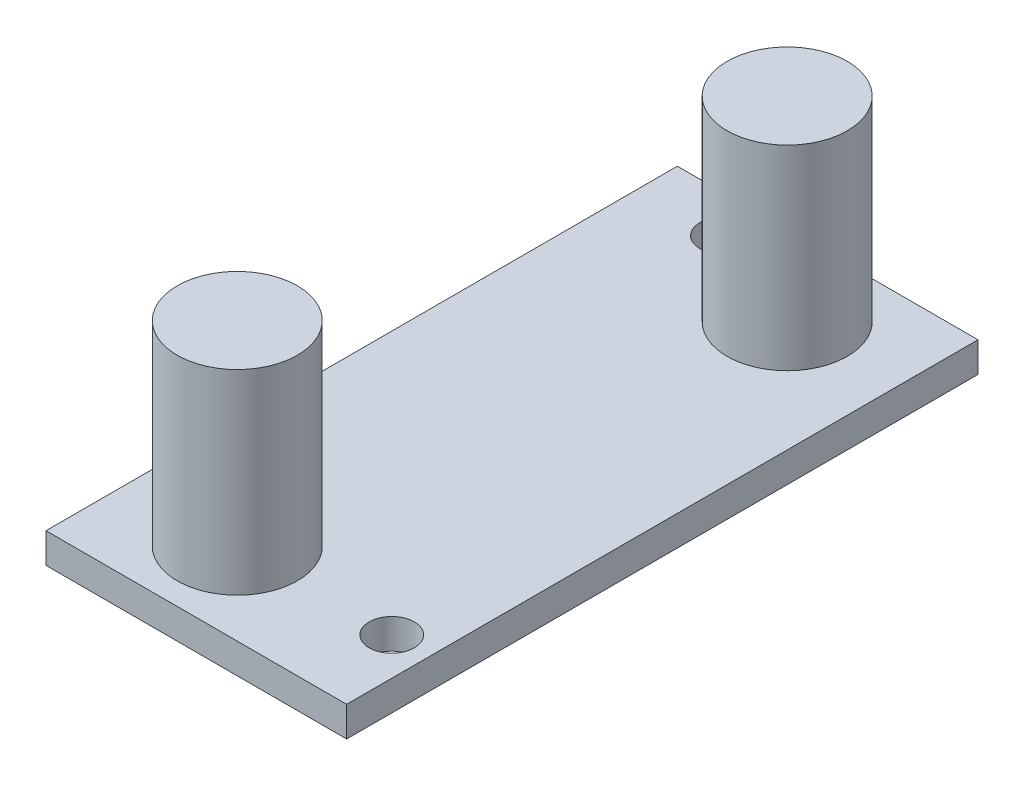
ISO-10303-21;
HEADER;
FILE_DESCRIPTION(('STEP AP214'),'2;1');
FILE_NAME('part.step','',(''),(''),'','','');
FILE_SCHEMA(('AUTOMOTIVE_DESIGN { 1 0 10303 214 1 1 1 1 }'));
ENDSEC;
DATA;
#1=APPLICATION_CONTEXT('core data for automotive mechanical design processes');
#2=APPLICATION_PROTOCOL_DEFINITION('international standard','automotive_design',2000,#1);
#3=PRODUCT_CONTEXT('',#1,'mechanical');
#4=PRODUCT('Part','Part','',(#3));
#5=PRODUCT_RELATED_PRODUCT_CATEGORY('part','',(#4));
#6=PRODUCT_DEFINITION_FORMATION('','',#4);
#7=PRODUCT_DEFINITION_CONTEXT('part definition',#1,'design');
#8=PRODUCT_DEFINITION('design','',#6,#7);
#9=PRODUCT_DEFINITION_SHAPE('','',#8);
#10=(LENGTH_UNIT() NAMED_UNIT(*) SI_UNIT(.MILLI.,.METRE.));
#11=(NAMED_UNIT(*) PLANE_ANGLE_UNIT() SI_UNIT($,.RADIAN.));
#12=(NAMED_UNIT(*) SI_UNIT($,.STERADIAN.) SOLID_ANGLE_UNIT());
#13=UNCERTAINTY_MEASURE_WITH_UNIT(LENGTH_MEASURE(1.E-05),#10,'distance_accuracy_value','');
#14=(GEOMETRIC_REPRESENTATION_CONTEXT(3) GLOBAL_UNCERTAINTY_ASSIGNED_CONTEXT((#13)) GLOBAL_UNIT_ASSIGNED_CONTEXT((#10,
#11,#12)) REPRESENTATION_CONTEXT('',''));
#15=CARTESIAN_POINT('',(0.,0.,0.));
#16=DIRECTION('',(0.,0.,1.));
#17=DIRECTION('',(1.,0.,0.));
#18=AXIS2_PLACEMENT_3D('',#15,#16,#17);
#19=CARTESIAN_POINT('',(10.,2.,21.));
#20=DIRECTION('',(-1.,0.,0.));
#21=DIRECTION('',(0.,0.,1.));
#22=AXIS2_PLACEMENT_3D('',#19,#20,#21);
#23=PLANE('',#22);
#24=DIRECTION('',(0.,0.,-1.));
#25=VECTOR('',#24,1.);
#26=CARTESIAN_POINT('',(10.,0.,21.));
#27=LINE('',#26,#25);
#28=CARTESIAN_POINT('',(10.,0.,21.));
#29=VERTEX_POINT('',#28);
#30=CARTESIAN_POINT('',(10.,0.,-21.));
#31=VERTEX_POINT('',#30);
#32=EDGE_CURVE('E112',#29,#31,#27,.T.);
#33=ORIENTED_EDGE('',*,*,#32,.T.);
#34=DIRECTION('',(0.,-1.,0.));
#35=VECTOR('',#34,1.);
#36=CARTESIAN_POINT('',(10.,2.,-21.));
#37=LINE('',#36,#35);
#38=CARTESIAN_POINT('',(10.,2.,-21.));
#39=VERTEX_POINT('',#38);
#40=EDGE_CURVE('E103',#39,#31,#37,.T.);
#41=ORIENTED_EDGE('',*,*,#40,.F.);
#42=DIRECTION('',(0.,0.,-1.));
#43=VECTOR('',#42,1.);
#44=CARTESIAN_POINT('',(10.,2.,21.));
#45=LINE('',#44,#43);
#46=CARTESIAN_POINT('',(10.,2.,21.));
#47=VERTEX_POINT('',#46);
#48=EDGE_CURVE('E97',#47,#39,#45,.T.);
#49=ORIENTED_EDGE('',*,*,#48,.F.);
#50=DIRECTION('',(0.,-1.,0.));
#51=VECTOR('',#50,1.);
#52=CARTESIAN_POINT('',(10.,2.,21.));
#53=LINE('',#52,#51);
#54=EDGE_CURVE('E108',#47,#29,#53,.T.);
#55=ORIENTED_EDGE('',*,*,#54,.T.);
#56=EDGE_LOOP('',(#33,#41,#49,#55));
#57=FACE_BOUND('',#56,.T.);
#58=ADVANCED_FACE('F45',(#57),#23,.F.);
#59=CARTESIAN_POINT('',(-10.,2.,-21.));
#60=DIRECTION('',(0.,0.,1.));
#61=DIRECTION('',(1.,0.,0.));
#62=AXIS2_PLACEMENT_3D('',#59,#60,#61);
#63=PLANE('',#62);
#64=DIRECTION('',(-1.,0.,0.));
#65=VECTOR('',#64,1.);
#66=CARTESIAN_POINT('',(-10.,0.,-21.));
#67=LINE('',#66,#65);
#68=CARTESIAN_POINT('',(-10.,0.,-21.));
#69=VERTEX_POINT('',#68);
#70=EDGE_CURVE('E102',#31,#69,#67,.T.);
#71=ORIENTED_EDGE('',*,*,#70,.T.);
#72=DIRECTION('',(0.,-1.,0.));
#73=VECTOR('',#72,1.);
#74=CARTESIAN_POINT('',(-10.,2.,-21.));
#75=LINE('',#74,#73);
#76=CARTESIAN_POINT('',(-10.,2.,-21.));
#77=VERTEX_POINT('',#76);
#78=EDGE_CURVE('E100',#77,#69,#75,.T.);
#79=ORIENTED_EDGE('',*,*,#78,.F.);
#80=DIRECTION('',(-1.,0.,0.));
#81=VECTOR('',#80,1.);
#82=CARTESIAN_POINT('',(-10.,2.,-21.));
#83=LINE('',#82,#81);
#84=EDGE_CURVE('E92',#39,#77,#83,.T.);
#85=ORIENTED_EDGE('',*,*,#84,.F.);
#86=ORIENTED_EDGE('',*,*,#40,.T.);
#87=EDGE_LOOP('',(#71,#79,#85,#86));
#88=FACE_BOUND('',#87,.T.);
#89=ADVANCED_FACE('F101',(#88),#63,.F.);
#90=CARTESIAN_POINT('',(-10.,2.,21.));
#91=DIRECTION('',(1.,0.,0.));
#92=DIRECTION('',(0.,0.,-1.));
#93=AXIS2_PLACEMENT_3D('',#90,#91,#92);
#94=PLANE('',#93);
#95=DIRECTION('',(0.,0.,1.));
#96=VECTOR('',#95,1.);
#97=CARTESIAN_POINT('',(-10.,0.,21.));
#98=LINE('',#97,#96);
#99=CARTESIAN_POINT('',(-10.,0.,21.));
#100=VERTEX_POINT('',#99);
#101=EDGE_CURVE('E78',#69,#100,#98,.T.);
#102=ORIENTED_EDGE('',*,*,#101,.T.);
#103=DIRECTION('',(0.,-1.,0.));
#104=VECTOR('',#103,1.);
#105=CARTESIAN_POINT('',(-10.,2.,21.));
#106=LINE('',#105,#104);
#107=CARTESIAN_POINT('',(-10.,2.,21.));
#108=VERTEX_POINT('',#107);
#109=EDGE_CURVE('E104',#108,#100,#106,.T.);
#110=ORIENTED_EDGE('',*,*,#109,.F.);
#111=DIRECTION('',(0.,0.,1.));
#112=VECTOR('',#111,1.);
#113=CARTESIAN_POINT('',(-10.,2.,21.));
#114=LINE('',#113,#112);
#115=EDGE_CURVE('E95',#77,#108,#114,.T.);
#116=ORIENTED_EDGE('',*,*,#115,.F.);
#117=ORIENTED_EDGE('',*,*,#78,.T.);
#118=EDGE_LOOP('',(#102,#110,#116,#117));
#119=FACE_BOUND('',#118,.T.);
#120=ADVANCED_FACE('F106',(#119),#94,.F.);
#121=CARTESIAN_POINT('',(-10.,2.,21.));
#122=DIRECTION('',(0.,0.,-1.));
#123=DIRECTION('',(-1.,0.,0.));
#124=AXIS2_PLACEMENT_3D('',#121,#122,#123);
#125=PLANE('',#124);
#126=DIRECTION('',(1.,0.,0.));
#127=VECTOR('',#126,1.);
#128=CARTESIAN_POINT('',(-10.,0.,21.));
#129=LINE('',#128,#127);
#130=EDGE_CURVE('E84',#100,#29,#129,.T.);
#131=ORIENTED_EDGE('',*,*,#130,.T.);
#132=ORIENTED_EDGE('',*,*,#54,.F.);
#133=DIRECTION('',(1.,0.,0.));
#134=VECTOR('',#133,1.);
#135=CARTESIAN_POINT('',(-10.,2.,21.));
#136=LINE('',#135,#134);
#137=EDGE_CURVE('E61',#108,#47,#136,.T.);
#138=ORIENTED_EDGE('',*,*,#137,.F.);
#139=ORIENTED_EDGE('',*,*,#109,.T.);
#140=EDGE_LOOP('',(#131,#132,#138,#139));
#141=FACE_BOUND('',#140,.T.);
#142=ADVANCED_FACE('F128',(#141),#125,.F.);
#143=CARTESIAN_POINT('',(0.,2.,0.));
#144=DIRECTION('',(0.,-1.,0.));
#145=DIRECTION('',(0.,0.,-1.));
#146=AXIS2_PLACEMENT_3D('',#143,#144,#145);
#147=PLANE('',#146);
#148=CARTESIAN_POINT('',(7.5,2.,15.5));
#149=DIRECTION('',(0.,1.,0.));
#150=DIRECTION('',(0.,0.,1.));
#151=AXIS2_PLACEMENT_3D('',#148,#149,#150);
#152=CIRCLE('',#151,1.5);
#153=CARTESIAN_POINT('',(7.5,2.,17.));
#154=VERTEX_POINT('',#153);
#155=EDGE_CURVE('E161',#154,#154,#152,.T.);
#156=ORIENTED_EDGE('',*,*,#155,.F.);
#157=EDGE_LOOP('',(#156));
#158=FACE_BOUND('',#157,.T.);
#159=CARTESIAN_POINT('',(-4.5,2.,-18.5));
#160=DIRECTION('',(0.,1.,0.));
#161=DIRECTION('',(0.,0.,1.));
#162=AXIS2_PLACEMENT_3D('',#159,#160,#161);
#163=CIRCLE('',#162,1.5);
#164=CARTESIAN_POINT('',(-4.5,2.,-17.));
#165=VERTEX_POINT('',#164);
#166=EDGE_CURVE('E155',#165,#165,#163,.T.);
#167=ORIENTED_EDGE('',*,*,#166,.F.);
#168=EDGE_LOOP('',(#167));
#169=FACE_BOUND('',#168,.T.);
#170=CARTESIAN_POINT('',(-2.74840159972659,2.,15.5259410453431));
#171=DIRECTION('',(0.,-1.,0.));
#172=DIRECTION('',(0.,0.,-1.));
#173=AXIS2_PLACEMENT_3D('',#170,#171,#172);
#174=CIRCLE('',#173,4.);
#175=CARTESIAN_POINT('',(-2.74840159972659,2.,11.5259410453431));
#176=VERTEX_POINT('',#175);
#177=EDGE_CURVE('E13',#176,#176,#174,.F.);
#178=ORIENTED_EDGE('',*,*,#177,.F.);
#179=EDGE_LOOP('',(#178));
#180=FACE_BOUND('',#179,.T.);
#181=CARTESIAN_POINT('',(2.61123832277543,2.,-15.6960883444702));
#182=DIRECTION('',(0.,-1.,0.));
#183=DIRECTION('',(0.,0.,-1.));
#184=AXIS2_PLACEMENT_3D('',#181,#182,#183);
#185=CIRCLE('',#184,4.);
#186=CARTESIAN_POINT('',(2.61123832277543,2.,-19.6960883444702));
#187=VERTEX_POINT('',#186);
#188=EDGE_CURVE('E53',#187,#187,#185,.F.);
#189=ORIENTED_EDGE('',*,*,#188,.F.);
#190=EDGE_LOOP('',(#189));
#191=FACE_BOUND('',#190,.T.);
#192=ORIENTED_EDGE('',*,*,#48,.T.);
#193=ORIENTED_EDGE('',*,*,#84,.T.);
#194=ORIENTED_EDGE('',*,*,#115,.T.);
#195=ORIENTED_EDGE('',*,*,#137,.T.);
#196=EDGE_LOOP('',(#192,#193,#194,#195));
#197=FACE_BOUND('',#196,.T.);
#198=ADVANCED_FACE('F93',(#158,#169,#180,#191,#197),#147,.F.);
#199=CARTESIAN_POINT('',(0.,0.,0.));
#200=DIRECTION('',(0.,-1.,0.));
#201=DIRECTION('',(0.,0.,-1.));
#202=AXIS2_PLACEMENT_3D('',#199,#200,#201);
#203=PLANE('',#202);
#204=CARTESIAN_POINT('',(7.5,0.,15.5));
#205=DIRECTION('',(0.,1.,0.));
#206=DIRECTION('',(0.,0.,1.));
#207=AXIS2_PLACEMENT_3D('',#204,#205,#206);
#208=CIRCLE('',#207,1.5);
#209=CARTESIAN_POINT('',(7.5,0.,17.));
#210=VERTEX_POINT('',#209);
#211=EDGE_CURVE('E158',#210,#210,#208,.T.);
#212=ORIENTED_EDGE('',*,*,#211,.T.);
#213=EDGE_LOOP('',(#212));
#214=FACE_BOUND('',#213,.T.);
#215=CARTESIAN_POINT('',(-4.5,0.,-18.5));
#216=DIRECTION('',(0.,1.,0.));
#217=DIRECTION('',(0.,0.,1.));
#218=AXIS2_PLACEMENT_3D('',#215,#216,#217);
#219=CIRCLE('',#218,1.5);
#220=CARTESIAN_POINT('',(-4.5,0.,-17.));
#221=VERTEX_POINT('',#220);
#222=EDGE_CURVE('E154',#221,#221,#219,.T.);
#223=ORIENTED_EDGE('',*,*,#222,.T.);
#224=EDGE_LOOP('',(#223));
#225=FACE_BOUND('',#224,.T.);
#226=ORIENTED_EDGE('',*,*,#32,.F.);
#227=ORIENTED_EDGE('',*,*,#130,.F.);
#228=ORIENTED_EDGE('',*,*,#101,.F.);
#229=ORIENTED_EDGE('',*,*,#70,.F.);
#230=EDGE_LOOP('',(#226,#227,#228,#229));
#231=FACE_BOUND('',#230,.T.);
#232=ADVANCED_FACE('F127',(#214,#225,#231),#203,.T.);
#233=CARTESIAN_POINT('',(2.61123832277543,15.,-15.6960883444702));
#234=DIRECTION('',(0.,-1.,0.));
#235=DIRECTION('',(0.,0.,-1.));
#236=AXIS2_PLACEMENT_3D('',#233,#234,#235);
#237=CYLINDRICAL_SURFACE('',#236,4.);
#238=CARTESIAN_POINT('',(2.61123832277543,15.,-15.6960883444702));
#239=DIRECTION('',(0.,1.,0.));
#240=DIRECTION('',(0.,0.,1.));
#241=AXIS2_PLACEMENT_3D('',#238,#239,#240);
#242=CIRCLE('',#241,4.);
#243=CARTESIAN_POINT('',(2.61123832277543,15.,-19.6960883444702));
#244=VERTEX_POINT('',#243);
#245=EDGE_CURVE('E115',#244,#244,#242,.T.);
#246=CARTESIAN_POINT('',(2.61123832277543,15.,-19.6960883444702));
#247=CARTESIAN_POINT('',(2.61123832277543,14.8645833333333,-19.6960883444702));
#248=CARTESIAN_POINT('',(2.61123832277543,14.7291666666667,-19.6960883444702));
#249=CARTESIAN_POINT('',(2.61123832277543,14.4583333333333,-19.6960883444702));
#250=CARTESIAN_POINT('',(2.61123832277543,14.3229166666667,-19.6960883444702));
#251=CARTESIAN_POINT('',(2.61123832277543,14.0520833333333,-19.6960883444702));
#252=CARTESIAN_POINT('',(2.61123832277543,13.9166666666667,-19.6960883444702));
#253=CARTESIAN_POINT('',(2.61123832277543,13.6458333333333,-19.6960883444702));
#254=CARTESIAN_POINT('',(2.61123832277543,13.5104166666667,-19.6960883444702));
#255=CARTESIAN_POINT('',(2.61123832277543,13.2395833333333,-19.6960883444702));
#256=CARTESIAN_POINT('',(2.61123832277543,13.1041666666667,-19.6960883444702));
#257=CARTESIAN_POINT('',(2.61123832277543,12.8333333333333,-19.6960883444702));
#258=CARTESIAN_POINT('',(2.61123832277543,12.6979166666667,-19.6960883444702));
#259=CARTESIAN_POINT('',(2.61123832277543,12.4270833333333,-19.6960883444702));
#260=CARTESIAN_POINT('',(2.61123832277543,12.2916666666667,-19.6960883444702));
#261=CARTESIAN_POINT('',(2.61123832277543,12.0208333333333,-19.6960883444702));
#262=CARTESIAN_POINT('',(2.61123832277543,11.8854166666667,-19.6960883444702));
#263=CARTESIAN_POINT('',(2.61123832277543,11.6145833333333,-19.6960883444702));
#264=CARTESIAN_POINT('',(2.61123832277543,11.4791666666667,-19.6960883444702));
#265=CARTESIAN_POINT('',(2.61123832277543,11.2083333333333,-19.6960883444702));
#266=CARTESIAN_POINT('',(2.61123832277543,11.0729166666667,-19.6960883444702));
#267=CARTESIAN_POINT('',(2.61123832277543,10.8020833333333,-19.6960883444702));
#268=CARTESIAN_POINT('',(2.61123832277543,10.6666666666667,-19.6960883444702));
#269=CARTESIAN_POINT('',(2.61123832277543,10.3958333333333,-19.6960883444702));
#270=CARTESIAN_POINT('',(2.61123832277543,10.2604166666667,-19.6960883444702));
#271=CARTESIAN_POINT('',(2.61123832277543,9.98958333333333,-19.6960883444702));
#272=CARTESIAN_POINT('',(2.61123832277543,9.85416666666667,-19.6960883444702));
#273=CARTESIAN_POINT('',(2.61123832277543,9.58333333333333,-19.6960883444702));
#274=CARTESIAN_POINT('',(2.61123832277543,9.44791666666667,-19.6960883444702));
#275=CARTESIAN_POINT('',(2.61123832277543,9.17708333333333,-19.6960883444702));
#276=CARTESIAN_POINT('',(2.61123832277543,9.04166666666667,-19.6960883444702));
#277=CARTESIAN_POINT('',(2.61123832277543,8.77083333333333,-19.6960883444702));
#278=CARTESIAN_POINT('',(2.61123832277543,8.63541666666667,-19.6960883444702));
#279=CARTESIAN_POINT('',(2.61123832277543,8.36458333333333,-19.6960883444702));
#280=CARTESIAN_POINT('',(2.61123832277543,8.22916666666667,-19.6960883444702));
#281=CARTESIAN_POINT('',(2.61123832277543,7.95833333333333,-19.6960883444702));
#282=CARTESIAN_POINT('',(2.61123832277543,7.82291666666667,-19.6960883444702));
#283=CARTESIAN_POINT('',(2.61123832277543,7.55208333333333,-19.6960883444702));
#284=CARTESIAN_POINT('',(2.61123832277543,7.41666666666667,-19.6960883444702));
#285=CARTESIAN_POINT('',(2.61123832277543,7.14583333333333,-19.6960883444702));
#286=CARTESIAN_POINT('',(2.61123832277543,7.01041666666667,-19.6960883444702));
#287=CARTESIAN_POINT('',(2.61123832277543,6.73958333333333,-19.6960883444702));
#288=CARTESIAN_POINT('',(2.61123832277543,6.60416666666667,-19.6960883444702));
#289=CARTESIAN_POINT('',(2.61123832277543,6.33333333333333,-19.6960883444702));
#290=CARTESIAN_POINT('',(2.61123832277543,6.19791666666667,-19.6960883444702));
#291=CARTESIAN_POINT('',(2.61123832277543,5.92708333333333,-19.6960883444702));
#292=CARTESIAN_POINT('',(2.61123832277543,5.79166666666667,-19.6960883444702));
#293=CARTESIAN_POINT('',(2.61123832277543,5.52083333333333,-19.6960883444702));
#294=CARTESIAN_POINT('',(2.61123832277543,5.38541666666667,-19.6960883444702));
#295=CARTESIAN_POINT('',(2.61123832277543,5.11458333333333,-19.6960883444702));
#296=CARTESIAN_POINT('',(2.61123832277543,4.97916666666667,-19.6960883444702));
#297=CARTESIAN_POINT('',(2.61123832277543,4.70833333333333,-19.6960883444702));
#298=CARTESIAN_POINT('',(2.61123832277543,4.57291666666667,-19.6960883444702));
#299=CARTESIAN_POINT('',(2.61123832277543,4.30208333333333,-19.6960883444702));
#300=CARTESIAN_POINT('',(2.61123832277543,4.16666666666667,-19.6960883444702));
#301=CARTESIAN_POINT('',(2.61123832277543,3.89583333333333,-19.6960883444702));
#302=CARTESIAN_POINT('',(2.61123832277543,3.76041666666667,-19.6960883444702));
#303=CARTESIAN_POINT('',(2.61123832277543,3.48958333333333,-19.6960883444702));
#304=CARTESIAN_POINT('',(2.61123832277543,3.35416666666667,-19.6960883444702));
#305=CARTESIAN_POINT('',(2.61123832277543,3.08333333333333,-19.6960883444702));
#306=CARTESIAN_POINT('',(2.61123832277543,2.94791666666667,-19.6960883444702));
#307=CARTESIAN_POINT('',(2.61123832277543,2.67708333333333,-19.6960883444702));
#308=CARTESIAN_POINT('',(2.61123832277543,2.54166666666667,-19.6960883444702));
#309=CARTESIAN_POINT('',(2.61123832277543,2.27083333333333,-19.6960883444702));
#310=CARTESIAN_POINT('',(2.61123832277543,2.13541666666667,-19.6960883444702));
#311=CARTESIAN_POINT('',(2.61123832277543,2.,-19.6960883444702));
#312=B_SPLINE_CURVE_WITH_KNOTS('',3,(#246,#247,#248,#249,#250,#251,#252,#253,#254,#255,#256,
#257,#258,#259,#260,#261,#262,#263,#264,#265,#266,#267,#268,#269,#270,#271,#272,#273,#274,#275,
#276,#277,#278,#279,#280,#281,#282,#283,#284,#285,#286,#287,#288,#289,#290,#291,#292,#293,#294,
#295,#296,#297,#298,#299,#300,#301,#302,#303,#304,#305,#306,#307,#308,#309,#310,#311),
.UNSPECIFIED.,.F.,.F.,(4,2,2,2,2,2,2,2,2,2,2,2,2,2,2,2,2,2,2,2,2,2,2,2,2,2,2,2,2,2,2,2,4),(0.,
0.406249999999999,0.812499999999999,1.21875,1.625,2.03125,2.4375,2.84375,3.25,3.65625,4.0625,
4.46875,4.875,5.28125,5.6875,6.09375,6.5,6.90625,7.3125,7.71875,8.125,8.53125,8.9375,9.34375,
9.75,10.15625,10.5625,10.96875,11.375,11.78125,12.1875,12.59375,13.),.UNSPECIFIED.);
#313=EDGE_CURVE('BSEAM124',#244,#187,#312,.T.);
#314=ORIENTED_EDGE('',*,*,#245,.F.);
#315=ORIENTED_EDGE('',*,*,#188,.T.);
#316=ORIENTED_EDGE('',*,*,#313,.T.);
#317=ORIENTED_EDGE('',*,*,#313,.F.);
#318=EDGE_LOOP('',(#314,#316,#315,#317));
#319=FACE_BOUND('',#318,.T.);
#320=ADVANCED_FACE('F124',(#319),#237,.T.);
#321=CARTESIAN_POINT('',(2.61123832277543,15.,-15.6960883444702));
#322=DIRECTION('',(0.,1.,0.));
#323=DIRECTION('',(0.,0.,1.));
#324=AXIS2_PLACEMENT_3D('',#321,#322,#323);
#325=PLANE('',#324);
#326=ORIENTED_EDGE('',*,*,#245,.T.);
#327=EDGE_LOOP('',(#326));
#328=FACE_BOUND('',#327,.T.);
#329=ADVANCED_FACE('F186',(#328),#325,.T.);
#330=CARTESIAN_POINT('',(-2.74840159972659,15.,15.5259410453431));
#331=DIRECTION('',(0.,-1.,0.));
#332=DIRECTION('',(0.,0.,-1.));
#333=AXIS2_PLACEMENT_3D('',#330,#331,#332);
#334=CYLINDRICAL_SURFACE('',#333,4.);
#335=CARTESIAN_POINT('',(-2.74840159972659,15.,15.5259410453431));
#336=DIRECTION('',(0.,1.,0.));
#337=DIRECTION('',(0.,0.,1.));
#338=AXIS2_PLACEMENT_3D('',#335,#336,#337);
#339=CIRCLE('',#338,4.);
#340=CARTESIAN_POINT('',(-2.74840159972659,15.,11.5259410453431));
#341=VERTEX_POINT('',#340);
#342=EDGE_CURVE('E151',#341,#341,#339,.T.);
#343=CARTESIAN_POINT('',(-2.74840159972659,15.,11.5259410453431));
#344=CARTESIAN_POINT('',(-2.74840159972659,14.8645833333333,11.5259410453431));
#345=CARTESIAN_POINT('',(-2.74840159972659,14.7291666666667,11.5259410453431));
#346=CARTESIAN_POINT('',(-2.74840159972659,14.4583333333333,11.5259410453431));
#347=CARTESIAN_POINT('',(-2.74840159972659,14.3229166666667,11.5259410453431));
#348=CARTESIAN_POINT('',(-2.74840159972659,14.0520833333333,11.5259410453431));
#349=CARTESIAN_POINT('',(-2.74840159972659,13.9166666666667,11.5259410453431));
#350=CARTESIAN_POINT('',(-2.74840159972659,13.6458333333333,11.5259410453431));
#351=CARTESIAN_POINT('',(-2.74840159972659,13.5104166666667,11.5259410453431));
#352=CARTESIAN_POINT('',(-2.74840159972659,13.2395833333333,11.5259410453431));
#353=CARTESIAN_POINT('',(-2.74840159972659,13.1041666666667,11.5259410453431));
#354=CARTESIAN_POINT('',(-2.74840159972659,12.8333333333333,11.5259410453431));
#355=CARTESIAN_POINT('',(-2.74840159972659,12.6979166666667,11.5259410453431));
#356=CARTESIAN_POINT('',(-2.74840159972659,12.4270833333333,11.5259410453431));
#357=CARTESIAN_POINT('',(-2.74840159972659,12.2916666666667,11.5259410453431));
#358=CARTESIAN_POINT('',(-2.74840159972659,12.0208333333333,11.5259410453431));
#359=CARTESIAN_POINT('',(-2.74840159972659,11.8854166666667,11.5259410453431));
#360=CARTESIAN_POINT('',(-2.74840159972659,11.6145833333333,11.5259410453431));
#361=CARTESIAN_POINT('',(-2.74840159972659,11.4791666666667,11.5259410453431));
#362=CARTESIAN_POINT('',(-2.74840159972659,11.2083333333333,11.5259410453431));
#363=CARTESIAN_POINT('',(-2.74840159972659,11.0729166666667,11.5259410453431));
#364=CARTESIAN_POINT('',(-2.74840159972659,10.8020833333333,11.5259410453431));
#365=CARTESIAN_POINT('',(-2.74840159972659,10.6666666666667,11.5259410453431));
#366=CARTESIAN_POINT('',(-2.74840159972659,10.3958333333333,11.5259410453431));
#367=CARTESIAN_POINT('',(-2.74840159972659,10.2604166666667,11.5259410453431));
#368=CARTESIAN_POINT('',(-2.74840159972659,9.98958333333333,11.5259410453431));
#369=CARTESIAN_POINT('',(-2.74840159972659,9.85416666666667,11.5259410453431));
#370=CARTESIAN_POINT('',(-2.74840159972659,9.58333333333333,11.5259410453431));
#371=CARTESIAN_POINT('',(-2.74840159972659,9.44791666666667,11.5259410453431));
#372=CARTESIAN_POINT('',(-2.74840159972659,9.17708333333333,11.5259410453431));
#373=CARTESIAN_POINT('',(-2.74840159972659,9.04166666666667,11.5259410453431));
#374=CARTESIAN_POINT('',(-2.74840159972659,8.77083333333333,11.5259410453431));
#375=CARTESIAN_POINT('',(-2.74840159972659,8.63541666666667,11.5259410453431));
#376=CARTESIAN_POINT('',(-2.74840159972659,8.36458333333333,11.5259410453431));
#377=CARTESIAN_POINT('',(-2.74840159972659,8.22916666666667,11.5259410453431));
#378=CARTESIAN_POINT('',(-2.74840159972659,7.95833333333333,11.5259410453431));
#379=CARTESIAN_POINT('',(-2.74840159972659,7.82291666666667,11.5259410453431));
#380=CARTESIAN_POINT('',(-2.74840159972659,7.55208333333333,11.5259410453431));
#381=CARTESIAN_POINT('',(-2.74840159972659,7.41666666666667,11.5259410453431));
#382=CARTESIAN_POINT('',(-2.74840159972659,7.14583333333333,11.5259410453431));
#383=CARTESIAN_POINT('',(-2.74840159972659,7.01041666666667,11.5259410453431));
#384=CARTESIAN_POINT('',(-2.74840159972659,6.73958333333333,11.5259410453431));
#385=CARTESIAN_POINT('',(-2.74840159972659,6.60416666666667,11.5259410453431));
#386=CARTESIAN_POINT('',(-2.74840159972659,6.33333333333333,11.5259410453431));
#387=CARTESIAN_POINT('',(-2.74840159972659,6.19791666666667,11.5259410453431));
#388=CARTESIAN_POINT('',(-2.74840159972659,5.92708333333333,11.5259410453431));
#389=CARTESIAN_POINT('',(-2.74840159972659,5.79166666666667,11.5259410453431));
#390=CARTESIAN_POINT('',(-2.74840159972659,5.52083333333333,11.5259410453431));
#391=CARTESIAN_POINT('',(-2.74840159972659,5.38541666666667,11.5259410453431));
#392=CARTESIAN_POINT('',(-2.74840159972659,5.11458333333333,11.5259410453431));
#393=CARTESIAN_POINT('',(-2.74840159972659,4.97916666666667,11.5259410453431));
#394=CARTESIAN_POINT('',(-2.74840159972659,4.70833333333333,11.5259410453431));
#395=CARTESIAN_POINT('',(-2.74840159972659,4.57291666666667,11.5259410453431));
#396=CARTESIAN_POINT('',(-2.74840159972659,4.30208333333333,11.5259410453431));
#397=CARTESIAN_POINT('',(-2.74840159972659,4.16666666666667,11.5259410453431));
#398=CARTESIAN_POINT('',(-2.74840159972659,3.89583333333333,11.5259410453431));
#399=CARTESIAN_POINT('',(-2.74840159972659,3.76041666666667,11.5259410453431));
#400=CARTESIAN_POINT('',(-2.74840159972659,3.48958333333333,11.5259410453431));
#401=CARTESIAN_POINT('',(-2.74840159972659,3.35416666666667,11.5259410453431));
#402=CARTESIAN_POINT('',(-2.74840159972659,3.08333333333333,11.5259410453431));
#403=CARTESIAN_POINT('',(-2.74840159972659,2.94791666666667,11.5259410453431));
#404=CARTESIAN_POINT('',(-2.74840159972659,2.67708333333333,11.5259410453431));
#405=CARTESIAN_POINT('',(-2.74840159972659,2.54166666666667,11.5259410453431));
#406=CARTESIAN_POINT('',(-2.74840159972659,2.27083333333333,11.5259410453431));
#407=CARTESIAN_POINT('',(-2.74840159972659,2.13541666666667,11.5259410453431));
#408=CARTESIAN_POINT('',(-2.74840159972659,2.,11.5259410453431));
#409=B_SPLINE_CURVE_WITH_KNOTS('',3,(#343,#344,#345,#346,#347,#348,#349,#350,#351,#352,#353,
#354,#355,#356,#357,#358,#359,#360,#361,#362,#363,#364,#365,#366,#367,#368,#369,#370,#371,#372,
#373,#374,#375,#376,#377,#378,#379,#380,#381,#382,#383,#384,#385,#386,#387,#388,#389,#390,#391,
#392,#393,#394,#395,#396,#397,#398,#399,#400,#401,#402,#403,#404,#405,#406,#407,#408),
.UNSPECIFIED.,.F.,.F.,(4,2,2,2,2,2,2,2,2,2,2,2,2,2,2,2,2,2,2,2,2,2,2,2,2,2,2,2,2,2,2,2,4),(0.,
0.406249999999999,0.812499999999999,1.21875,1.625,2.03125,2.4375,2.84375,3.25,3.65625,4.0625,
4.46875,4.875,5.28125,5.6875,6.09375,6.5,6.90625,7.3125,7.71875,8.125,8.53125,8.9375,9.34375,
9.75,10.15625,10.5625,10.96875,11.375,11.78125,12.1875,12.59375,13.),.UNSPECIFIED.);
#410=EDGE_CURVE('BSEAM182',#341,#176,#409,.T.);
#411=ORIENTED_EDGE('',*,*,#342,.F.);
#412=ORIENTED_EDGE('',*,*,#177,.T.);
#413=ORIENTED_EDGE('',*,*,#410,.T.);
#414=ORIENTED_EDGE('',*,*,#410,.F.);
#415=EDGE_LOOP('',(#411,#413,#412,#414));
#416=FACE_BOUND('',#415,.T.);
#417=ADVANCED_FACE('F182',(#416),#334,.T.);
#418=CARTESIAN_POINT('',(-2.74840159972659,15.,15.5259410453431));
#419=DIRECTION('',(0.,1.,0.));
#420=DIRECTION('',(0.,0.,1.));
#421=AXIS2_PLACEMENT_3D('',#418,#419,#420);
#422=PLANE('',#421);
#423=ORIENTED_EDGE('',*,*,#342,.T.);
#424=EDGE_LOOP('',(#423));
#425=FACE_BOUND('',#424,.T.);
#426=ADVANCED_FACE('F176',(#425),#422,.T.);
#427=CARTESIAN_POINT('',(-4.5,0.,-18.5));
#428=DIRECTION('',(0.,1.,0.));
#429=DIRECTION('',(0.,0.,1.));
#430=AXIS2_PLACEMENT_3D('',#427,#428,#429);
#431=CYLINDRICAL_SURFACE('',#430,1.5);
#432=ORIENTED_EDGE('',*,*,#222,.F.);
#433=EDGE_LOOP('',(#432));
#434=FACE_BOUND('',#433,.T.);
#435=ORIENTED_EDGE('',*,*,#166,.T.);
#436=EDGE_LOOP('',(#435));
#437=FACE_BOUND('',#436,.T.);
#438=ADVANCED_FACE('F171',(#434,#437),#431,.F.);
#439=CARTESIAN_POINT('',(7.5,0.,15.5));
#440=DIRECTION('',(0.,1.,0.));
#441=DIRECTION('',(0.,0.,1.));
#442=AXIS2_PLACEMENT_3D('',#439,#440,#441);
#443=CYLINDRICAL_SURFACE('',#442,1.5);
#444=ORIENTED_EDGE('',*,*,#211,.F.);
#445=EDGE_LOOP('',(#444));
#446=FACE_BOUND('',#445,.T.);
#447=ORIENTED_EDGE('',*,*,#155,.T.);
#448=EDGE_LOOP('',(#447));
#449=FACE_BOUND('',#448,.T.);
#450=ADVANCED_FACE('F168',(#446,#449),#443,.F.);
#451=CLOSED_SHELL('',(#58,#89,#120,#142,#198,#232,#320,#329,#417,#426,#438,#450));
#452=MANIFOLD_SOLID_BREP('B2',#451);
#453=ADVANCED_BREP_SHAPE_REPRESENTATION('',(#18,#452),#14);
#454=SHAPE_DEFINITION_REPRESENTATION(#9,#453);
ENDSEC;
END-ISO-10303-21;
